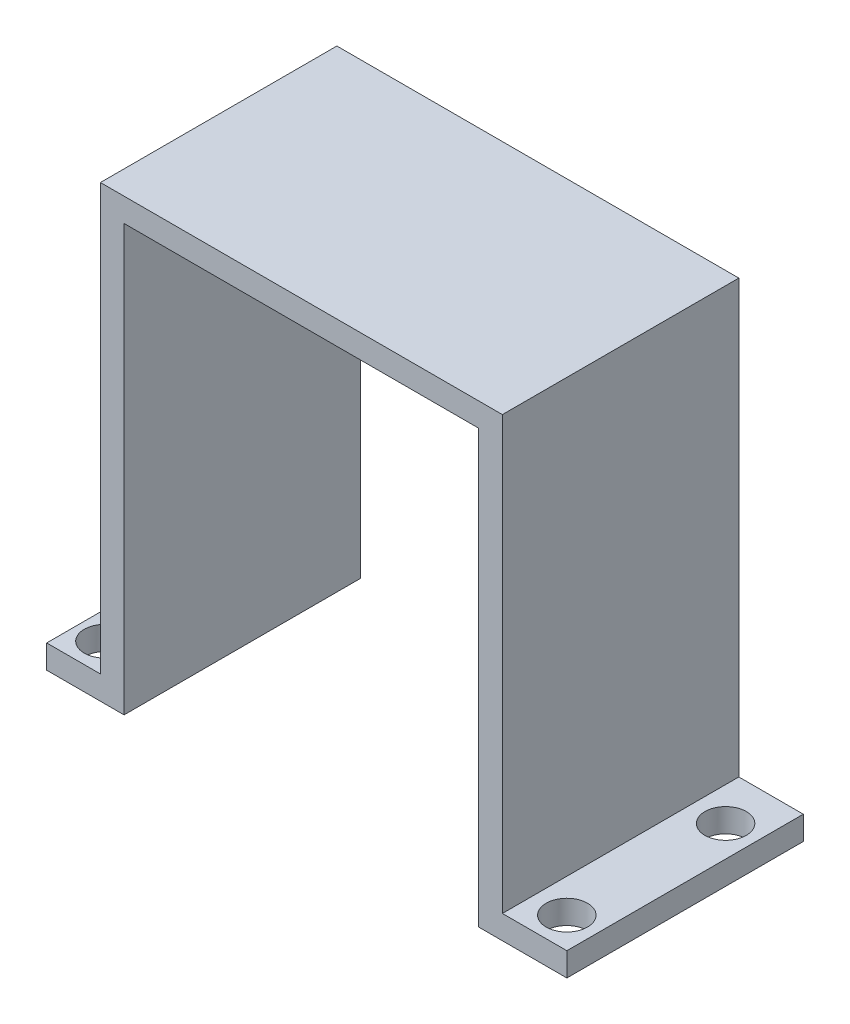
ISO-10303-21;
HEADER;
FILE_DESCRIPTION(('STEP AP214'),'2;1');
FILE_NAME('part.step','',(''),(''),'','','');
FILE_SCHEMA(('AUTOMOTIVE_DESIGN { 1 0 10303 214 1 1 1 1 }'));
ENDSEC;
DATA;
#1=APPLICATION_CONTEXT('core data for automotive mechanical design processes');
#2=APPLICATION_PROTOCOL_DEFINITION('international standard','automotive_design',2000,#1);
#3=PRODUCT_CONTEXT('',#1,'mechanical');
#4=PRODUCT('Part','Part','',(#3));
#5=PRODUCT_RELATED_PRODUCT_CATEGORY('part','',(#4));
#6=PRODUCT_DEFINITION_FORMATION('','',#4);
#7=PRODUCT_DEFINITION_CONTEXT('part definition',#1,'design');
#8=PRODUCT_DEFINITION('design','',#6,#7);
#9=PRODUCT_DEFINITION_SHAPE('','',#8);
#10=(LENGTH_UNIT() NAMED_UNIT(*) SI_UNIT(.MILLI.,.METRE.));
#11=(NAMED_UNIT(*) PLANE_ANGLE_UNIT() SI_UNIT($,.RADIAN.));
#12=(NAMED_UNIT(*) SI_UNIT($,.STERADIAN.) SOLID_ANGLE_UNIT());
#13=UNCERTAINTY_MEASURE_WITH_UNIT(LENGTH_MEASURE(1.E-05),#10,'distance_accuracy_value','');
#14=(GEOMETRIC_REPRESENTATION_CONTEXT(3) GLOBAL_UNCERTAINTY_ASSIGNED_CONTEXT((#13)) GLOBAL_UNIT_ASSIGNED_CONTEXT((#10,
#11,#12)) REPRESENTATION_CONTEXT('',''));
#15=CARTESIAN_POINT('',(0.,0.,0.));
#16=DIRECTION('',(0.,0.,1.));
#17=DIRECTION('',(1.,0.,0.));
#18=AXIS2_PLACEMENT_3D('',#15,#16,#17);
#19=CARTESIAN_POINT('',(7.34336609336604,17.5454545454545,20.));
#20=DIRECTION('',(0.,-1.,0.));
#21=DIRECTION('',(1.,0.,0.));
#22=AXIS2_PLACEMENT_3D('',#19,#20,#21);
#23=PLANE('',#22);
#24=DIRECTION('',(-1.,0.,0.));
#25=VECTOR('',#24,1.);
#26=CARTESIAN_POINT('',(7.34336609336604,17.5454545454545,0.));
#27=LINE('',#26,#25);
#28=CARTESIAN_POINT('',(7.34336609336604,17.5454545454545,0.));
#29=VERTEX_POINT('',#28);
#30=CARTESIAN_POINT('',(-22.656633906634,17.5454545454545,0.));
#31=VERTEX_POINT('',#30);
#32=EDGE_CURVE('E160',#29,#31,#27,.T.);
#33=ORIENTED_EDGE('',*,*,#32,.F.);
#34=DIRECTION('',(0.,0.,-1.));
#35=VECTOR('',#34,1.);
#36=CARTESIAN_POINT('',(7.34336609336604,17.5454545454545,20.));
#37=LINE('',#36,#35);
#38=CARTESIAN_POINT('',(7.34336609336604,17.5454545454545,20.));
#39=VERTEX_POINT('',#38);
#40=EDGE_CURVE('E239',#39,#29,#37,.T.);
#41=ORIENTED_EDGE('',*,*,#40,.F.);
#42=DIRECTION('',(-1.,0.,0.));
#43=VECTOR('',#42,1.);
#44=CARTESIAN_POINT('',(7.34336609336604,17.5454545454545,20.));
#45=LINE('',#44,#43);
#46=CARTESIAN_POINT('',(-22.656633906634,17.5454545454545,20.));
#47=VERTEX_POINT('',#46);
#48=EDGE_CURVE('E168',#39,#47,#45,.T.);
#49=ORIENTED_EDGE('',*,*,#48,.T.);
#50=DIRECTION('',(0.,0.,-1.));
#51=VECTOR('',#50,1.);
#52=CARTESIAN_POINT('',(-22.656633906634,17.5454545454545,20.));
#53=LINE('',#52,#51);
#54=EDGE_CURVE('E204',#47,#31,#53,.T.);
#55=ORIENTED_EDGE('',*,*,#54,.T.);
#56=EDGE_LOOP('',(#33,#41,#49,#55));
#57=FACE_BOUND('',#56,.T.);
#58=ADVANCED_FACE('F33',(#57),#23,.T.);
#59=CARTESIAN_POINT('',(7.34336609336604,-19.,20.));
#60=DIRECTION('',(-1.,0.,0.));
#61=DIRECTION('',(0.,0.,1.));
#62=AXIS2_PLACEMENT_3D('',#59,#60,#61);
#63=PLANE('',#62);
#64=DIRECTION('',(0.,1.,0.));
#65=VECTOR('',#64,1.);
#66=CARTESIAN_POINT('',(7.34336609336604,-19.,0.));
#67=LINE('',#66,#65);
#68=CARTESIAN_POINT('',(7.34336609336604,-19.,0.));
#69=VERTEX_POINT('',#68);
#70=EDGE_CURVE('E172',#69,#29,#67,.T.);
#71=ORIENTED_EDGE('',*,*,#70,.F.);
#72=DIRECTION('',(0.,0.,-1.));
#73=VECTOR('',#72,1.);
#74=CARTESIAN_POINT('',(7.34336609336604,-19.,20.));
#75=LINE('',#74,#73);
#76=CARTESIAN_POINT('',(7.34336609336604,-19.,20.));
#77=VERTEX_POINT('',#76);
#78=EDGE_CURVE('E242',#77,#69,#75,.T.);
#79=ORIENTED_EDGE('',*,*,#78,.F.);
#80=DIRECTION('',(0.,1.,0.));
#81=VECTOR('',#80,1.);
#82=CARTESIAN_POINT('',(7.34336609336604,-19.,20.));
#83=LINE('',#82,#81);
#84=EDGE_CURVE('E201',#77,#39,#83,.T.);
#85=ORIENTED_EDGE('',*,*,#84,.T.);
#86=ORIENTED_EDGE('',*,*,#40,.T.);
#87=EDGE_LOOP('',(#71,#79,#85,#86));
#88=FACE_BOUND('',#87,.T.);
#89=ADVANCED_FACE('F332',(#88),#63,.T.);
#90=CARTESIAN_POINT('',(14.7979115479116,-19.,20.));
#91=DIRECTION('',(0.,-1.,0.));
#92=DIRECTION('',(0.,0.,-1.));
#93=AXIS2_PLACEMENT_3D('',#90,#91,#92);
#94=PLANE('',#93);
#95=CARTESIAN_POINT('',(12.1897996861815,-19.,3.96520095725261));
#96=DIRECTION('',(0.,-1.,0.));
#97=DIRECTION('',(0.,0.,-1.));
#98=AXIS2_PLACEMENT_3D('',#95,#96,#97);
#99=CIRCLE('',#98,1.74999999999999);
#100=CARTESIAN_POINT('',(12.1897996861815,-19.,2.21520095725262));
#101=VERTEX_POINT('',#100);
#102=EDGE_CURVE('E264',#101,#101,#99,.T.);
#103=ORIENTED_EDGE('',*,*,#102,.F.);
#104=EDGE_LOOP('',(#103));
#105=FACE_BOUND('',#104,.T.);
#106=CARTESIAN_POINT('',(12.1897996861815,-19.,17.3968590723765));
#107=DIRECTION('',(0.,-1.,0.));
#108=DIRECTION('',(0.,0.,-1.));
#109=AXIS2_PLACEMENT_3D('',#106,#107,#108);
#110=CIRCLE('',#109,1.74999999999999);
#111=CARTESIAN_POINT('',(12.1897996861815,-19.,15.6468590723765));
#112=VERTEX_POINT('',#111);
#113=EDGE_CURVE('E280',#112,#112,#110,.T.);
#114=ORIENTED_EDGE('',*,*,#113,.F.);
#115=EDGE_LOOP('',(#114));
#116=FACE_BOUND('',#115,.T.);
#117=DIRECTION('',(-1.,0.,0.));
#118=VECTOR('',#117,1.);
#119=CARTESIAN_POINT('',(14.7979115479116,-19.,0.));
#120=LINE('',#119,#118);
#121=CARTESIAN_POINT('',(14.7979115479116,-19.,0.));
#122=VERTEX_POINT('',#121);
#123=EDGE_CURVE('E234',#122,#69,#120,.T.);
#124=ORIENTED_EDGE('',*,*,#123,.F.);
#125=DIRECTION('',(0.,0.,-1.));
#126=VECTOR('',#125,1.);
#127=CARTESIAN_POINT('',(14.7979115479116,-19.,20.));
#128=LINE('',#127,#126);
#129=CARTESIAN_POINT('',(14.7979115479116,-19.,20.));
#130=VERTEX_POINT('',#129);
#131=EDGE_CURVE('E244',#130,#122,#128,.T.);
#132=ORIENTED_EDGE('',*,*,#131,.F.);
#133=DIRECTION('',(-1.,0.,0.));
#134=VECTOR('',#133,1.);
#135=CARTESIAN_POINT('',(14.7979115479116,-19.,20.));
#136=LINE('',#135,#134);
#137=EDGE_CURVE('E198',#130,#77,#136,.T.);
#138=ORIENTED_EDGE('',*,*,#137,.T.);
#139=ORIENTED_EDGE('',*,*,#78,.T.);
#140=EDGE_LOOP('',(#124,#132,#138,#139));
#141=FACE_BOUND('',#140,.T.);
#142=ADVANCED_FACE('F353',(#105,#116,#141),#94,.T.);
#143=CARTESIAN_POINT('',(14.7979115479116,-17.,20.));
#144=DIRECTION('',(1.,0.,0.));
#145=DIRECTION('',(0.,0.,-1.));
#146=AXIS2_PLACEMENT_3D('',#143,#144,#145);
#147=PLANE('',#146);
#148=DIRECTION('',(0.,-1.,0.));
#149=VECTOR('',#148,1.);
#150=CARTESIAN_POINT('',(14.7979115479116,-17.,0.));
#151=LINE('',#150,#149);
#152=CARTESIAN_POINT('',(14.7979115479116,-17.,0.));
#153=VERTEX_POINT('',#152);
#154=EDGE_CURVE('E231',#153,#122,#151,.T.);
#155=ORIENTED_EDGE('',*,*,#154,.F.);
#156=DIRECTION('',(0.,0.,-1.));
#157=VECTOR('',#156,1.);
#158=CARTESIAN_POINT('',(14.7979115479116,-17.,20.));
#159=LINE('',#158,#157);
#160=CARTESIAN_POINT('',(14.7979115479116,-17.,20.));
#161=VERTEX_POINT('',#160);
#162=EDGE_CURVE('E246',#161,#153,#159,.T.);
#163=ORIENTED_EDGE('',*,*,#162,.F.);
#164=DIRECTION('',(0.,-1.,0.));
#165=VECTOR('',#164,1.);
#166=CARTESIAN_POINT('',(14.7979115479116,-17.,20.));
#167=LINE('',#166,#165);
#168=EDGE_CURVE('E195',#161,#130,#167,.T.);
#169=ORIENTED_EDGE('',*,*,#168,.T.);
#170=ORIENTED_EDGE('',*,*,#131,.T.);
#171=EDGE_LOOP('',(#155,#163,#169,#170));
#172=FACE_BOUND('',#171,.T.);
#173=ADVANCED_FACE('F339',(#172),#147,.T.);
#174=CARTESIAN_POINT('',(9.34336609336604,-17.,20.));
#175=DIRECTION('',(0.,1.,0.));
#176=DIRECTION('',(0.,0.,1.));
#177=AXIS2_PLACEMENT_3D('',#174,#175,#176);
#178=PLANE('',#177);
#179=CARTESIAN_POINT('',(12.1897996861815,-17.,3.96520095725261));
#180=DIRECTION('',(0.,1.,0.));
#181=DIRECTION('',(0.,0.,1.));
#182=AXIS2_PLACEMENT_3D('',#179,#180,#181);
#183=CIRCLE('',#182,1.74999999999999);
#184=CARTESIAN_POINT('',(12.1897996861815,-17.,5.7152009572526));
#185=VERTEX_POINT('',#184);
#186=EDGE_CURVE('E268',#185,#185,#183,.T.);
#187=ORIENTED_EDGE('',*,*,#186,.F.);
#188=EDGE_LOOP('',(#187));
#189=FACE_BOUND('',#188,.T.);
#190=CARTESIAN_POINT('',(12.1897996861815,-17.,17.3968590723765));
#191=DIRECTION('',(0.,1.,0.));
#192=DIRECTION('',(0.,0.,1.));
#193=AXIS2_PLACEMENT_3D('',#190,#191,#192);
#194=CIRCLE('',#193,1.74999999999999);
#195=CARTESIAN_POINT('',(12.1897996861815,-17.,19.1468590723765));
#196=VERTEX_POINT('',#195);
#197=EDGE_CURVE('E267',#196,#196,#194,.T.);
#198=ORIENTED_EDGE('',*,*,#197,.F.);
#199=EDGE_LOOP('',(#198));
#200=FACE_BOUND('',#199,.T.);
#201=DIRECTION('',(1.,0.,0.));
#202=VECTOR('',#201,1.);
#203=CARTESIAN_POINT('',(9.34336609336604,-17.,0.));
#204=LINE('',#203,#202);
#205=CARTESIAN_POINT('',(9.34336609336604,-17.,0.));
#206=VERTEX_POINT('',#205);
#207=EDGE_CURVE('E228',#206,#153,#204,.T.);
#208=ORIENTED_EDGE('',*,*,#207,.F.);
#209=DIRECTION('',(0.,0.,-1.));
#210=VECTOR('',#209,1.);
#211=CARTESIAN_POINT('',(9.34336609336604,-17.,20.));
#212=LINE('',#211,#210);
#213=CARTESIAN_POINT('',(9.34336609336604,-17.,20.));
#214=VERTEX_POINT('',#213);
#215=EDGE_CURVE('E248',#214,#206,#212,.T.);
#216=ORIENTED_EDGE('',*,*,#215,.F.);
#217=DIRECTION('',(1.,0.,0.));
#218=VECTOR('',#217,1.);
#219=CARTESIAN_POINT('',(9.34336609336604,-17.,20.));
#220=LINE('',#219,#218);
#221=EDGE_CURVE('E192',#214,#161,#220,.T.);
#222=ORIENTED_EDGE('',*,*,#221,.T.);
#223=ORIENTED_EDGE('',*,*,#162,.T.);
#224=EDGE_LOOP('',(#208,#216,#222,#223));
#225=FACE_BOUND('',#224,.T.);
#226=ADVANCED_FACE('F343',(#189,#200,#225),#178,.T.);
#227=CARTESIAN_POINT('',(9.34336609336604,19.5454545454545,20.));
#228=DIRECTION('',(1.,0.,0.));
#229=DIRECTION('',(0.,1.,0.));
#230=AXIS2_PLACEMENT_3D('',#227,#228,#229);
#231=PLANE('',#230);
#232=DIRECTION('',(0.,-1.,0.));
#233=VECTOR('',#232,1.);
#234=CARTESIAN_POINT('',(9.34336609336604,19.5454545454545,0.));
#235=LINE('',#234,#233);
#236=CARTESIAN_POINT('',(9.34336609336604,19.5454545454545,0.));
#237=VERTEX_POINT('',#236);
#238=EDGE_CURVE('E225',#237,#206,#235,.T.);
#239=ORIENTED_EDGE('',*,*,#238,.F.);
#240=DIRECTION('',(0.,0.,-1.));
#241=VECTOR('',#240,1.);
#242=CARTESIAN_POINT('',(9.34336609336604,19.5454545454545,20.));
#243=LINE('',#242,#241);
#244=CARTESIAN_POINT('',(9.34336609336604,19.5454545454545,20.));
#245=VERTEX_POINT('',#244);
#246=EDGE_CURVE('E250',#245,#237,#243,.T.);
#247=ORIENTED_EDGE('',*,*,#246,.F.);
#248=DIRECTION('',(0.,-1.,0.));
#249=VECTOR('',#248,1.);
#250=CARTESIAN_POINT('',(9.34336609336604,19.5454545454545,20.));
#251=LINE('',#250,#249);
#252=EDGE_CURVE('E189',#245,#214,#251,.T.);
#253=ORIENTED_EDGE('',*,*,#252,.T.);
#254=ORIENTED_EDGE('',*,*,#215,.T.);
#255=EDGE_LOOP('',(#239,#247,#253,#254));
#256=FACE_BOUND('',#255,.T.);
#257=ADVANCED_FACE('F348',(#256),#231,.T.);
#258=CARTESIAN_POINT('',(-24.656633906634,19.5454545454545,20.));
#259=DIRECTION('',(0.,1.,0.));
#260=DIRECTION('',(0.,0.,1.));
#261=AXIS2_PLACEMENT_3D('',#258,#259,#260);
#262=PLANE('',#261);
#263=DIRECTION('',(1.,0.,0.));
#264=VECTOR('',#263,1.);
#265=CARTESIAN_POINT('',(-24.656633906634,19.5454545454545,0.));
#266=LINE('',#265,#264);
#267=CARTESIAN_POINT('',(-24.656633906634,19.5454545454545,0.));
#268=VERTEX_POINT('',#267);
#269=EDGE_CURVE('E222',#268,#237,#266,.T.);
#270=ORIENTED_EDGE('',*,*,#269,.F.);
#271=DIRECTION('',(0.,0.,-1.));
#272=VECTOR('',#271,1.);
#273=CARTESIAN_POINT('',(-24.656633906634,19.5454545454545,20.));
#274=LINE('',#273,#272);
#275=CARTESIAN_POINT('',(-24.656633906634,19.5454545454545,20.));
#276=VERTEX_POINT('',#275);
#277=EDGE_CURVE('E252',#276,#268,#274,.T.);
#278=ORIENTED_EDGE('',*,*,#277,.F.);
#279=DIRECTION('',(1.,0.,0.));
#280=VECTOR('',#279,1.);
#281=CARTESIAN_POINT('',(-24.656633906634,19.5454545454545,20.));
#282=LINE('',#281,#280);
#283=EDGE_CURVE('E186',#276,#245,#282,.T.);
#284=ORIENTED_EDGE('',*,*,#283,.T.);
#285=ORIENTED_EDGE('',*,*,#246,.T.);
#286=EDGE_LOOP('',(#270,#278,#284,#285));
#287=FACE_BOUND('',#286,.T.);
#288=ADVANCED_FACE('F351',(#287),#262,.T.);
#289=CARTESIAN_POINT('',(-24.656633906634,-16.4545454545455,20.));
#290=DIRECTION('',(-1.,0.,0.));
#291=DIRECTION('',(0.,0.,1.));
#292=AXIS2_PLACEMENT_3D('',#289,#290,#291);
#293=PLANE('',#292);
#294=DIRECTION('',(0.,1.,0.));
#295=VECTOR('',#294,1.);
#296=CARTESIAN_POINT('',(-24.656633906634,-16.4545454545455,0.));
#297=LINE('',#296,#295);
#298=CARTESIAN_POINT('',(-24.656633906634,-16.4545454545455,0.));
#299=VERTEX_POINT('',#298);
#300=EDGE_CURVE('E219',#299,#268,#297,.T.);
#301=ORIENTED_EDGE('',*,*,#300,.F.);
#302=DIRECTION('',(0.,0.,-1.));
#303=VECTOR('',#302,1.);
#304=CARTESIAN_POINT('',(-24.656633906634,-16.4545454545455,20.));
#305=LINE('',#304,#303);
#306=CARTESIAN_POINT('',(-24.656633906634,-16.4545454545455,20.));
#307=VERTEX_POINT('',#306);
#308=EDGE_CURVE('E254',#307,#299,#305,.T.);
#309=ORIENTED_EDGE('',*,*,#308,.F.);
#310=DIRECTION('',(0.,1.,0.));
#311=VECTOR('',#310,1.);
#312=CARTESIAN_POINT('',(-24.656633906634,-16.4545454545455,20.));
#313=LINE('',#312,#311);
#314=EDGE_CURVE('E183',#307,#276,#313,.T.);
#315=ORIENTED_EDGE('',*,*,#314,.T.);
#316=ORIENTED_EDGE('',*,*,#277,.T.);
#317=EDGE_LOOP('',(#301,#309,#315,#316));
#318=FACE_BOUND('',#317,.T.);
#319=ADVANCED_FACE('F303',(#318),#293,.T.);
#320=CARTESIAN_POINT('',(-29.2020884520885,-16.4545454545455,20.));
#321=DIRECTION('',(0.,1.,0.));
#322=DIRECTION('',(0.,0.,1.));
#323=AXIS2_PLACEMENT_3D('',#320,#321,#322);
#324=PLANE('',#323);
#325=CARTESIAN_POINT('',(-26.8643753375741,-16.4545454545455,17.4113133420661));
#326=DIRECTION('',(0.,1.,0.));
#327=DIRECTION('',(0.,0.,1.));
#328=AXIS2_PLACEMENT_3D('',#325,#326,#327);
#329=CIRCLE('',#328,1.74999999999999);
#330=CARTESIAN_POINT('',(-26.8643753375741,-16.4545454545455,19.1613133420661));
#331=VERTEX_POINT('',#330);
#332=EDGE_CURVE('E294',#331,#331,#329,.T.);
#333=ORIENTED_EDGE('',*,*,#332,.F.);
#334=EDGE_LOOP('',(#333));
#335=FACE_BOUND('',#334,.T.);
#336=CARTESIAN_POINT('',(-26.8643753375741,-16.4545454545455,4.22877011904532));
#337=DIRECTION('',(0.,1.,0.));
#338=DIRECTION('',(0.,0.,1.));
#339=AXIS2_PLACEMENT_3D('',#336,#337,#338);
#340=CIRCLE('',#339,1.74999999999999);
#341=CARTESIAN_POINT('',(-26.8643753375741,-16.4545454545455,5.97877011904531));
#342=VERTEX_POINT('',#341);
#343=EDGE_CURVE('E154',#342,#342,#340,.T.);
#344=ORIENTED_EDGE('',*,*,#343,.F.);
#345=EDGE_LOOP('',(#344));
#346=FACE_BOUND('',#345,.T.);
#347=DIRECTION('',(1.,0.,0.));
#348=VECTOR('',#347,1.);
#349=CARTESIAN_POINT('',(-29.2020884520885,-16.4545454545455,0.));
#350=LINE('',#349,#348);
#351=CARTESIAN_POINT('',(-29.2020884520885,-16.4545454545455,0.));
#352=VERTEX_POINT('',#351);
#353=EDGE_CURVE('E216',#352,#299,#350,.T.);
#354=ORIENTED_EDGE('',*,*,#353,.F.);
#355=DIRECTION('',(0.,0.,-1.));
#356=VECTOR('',#355,1.);
#357=CARTESIAN_POINT('',(-29.2020884520885,-16.4545454545455,20.));
#358=LINE('',#357,#356);
#359=CARTESIAN_POINT('',(-29.2020884520885,-16.4545454545455,20.));
#360=VERTEX_POINT('',#359);
#361=EDGE_CURVE('E256',#360,#352,#358,.T.);
#362=ORIENTED_EDGE('',*,*,#361,.F.);
#363=DIRECTION('',(1.,0.,0.));
#364=VECTOR('',#363,1.);
#365=CARTESIAN_POINT('',(-29.2020884520885,-16.4545454545455,20.));
#366=LINE('',#365,#364);
#367=EDGE_CURVE('E180',#360,#307,#366,.T.);
#368=ORIENTED_EDGE('',*,*,#367,.T.);
#369=ORIENTED_EDGE('',*,*,#308,.T.);
#370=EDGE_LOOP('',(#354,#362,#368,#369));
#371=FACE_BOUND('',#370,.T.);
#372=ADVANCED_FACE('F299',(#335,#346,#371),#324,.T.);
#373=CARTESIAN_POINT('',(-29.2020884520885,-18.4545454545455,20.));
#374=DIRECTION('',(-1.,0.,0.));
#375=DIRECTION('',(0.,0.,1.));
#376=AXIS2_PLACEMENT_3D('',#373,#374,#375);
#377=PLANE('',#376);
#378=DIRECTION('',(0.,1.,0.));
#379=VECTOR('',#378,1.);
#380=CARTESIAN_POINT('',(-29.2020884520885,-18.4545454545455,0.));
#381=LINE('',#380,#379);
#382=CARTESIAN_POINT('',(-29.2020884520885,-18.4545454545455,0.));
#383=VERTEX_POINT('',#382);
#384=EDGE_CURVE('E213',#383,#352,#381,.T.);
#385=ORIENTED_EDGE('',*,*,#384,.F.);
#386=DIRECTION('',(0.,0.,-1.));
#387=VECTOR('',#386,1.);
#388=CARTESIAN_POINT('',(-29.2020884520885,-18.4545454545455,20.));
#389=LINE('',#388,#387);
#390=CARTESIAN_POINT('',(-29.2020884520885,-18.4545454545455,20.));
#391=VERTEX_POINT('',#390);
#392=EDGE_CURVE('E258',#391,#383,#389,.T.);
#393=ORIENTED_EDGE('',*,*,#392,.F.);
#394=DIRECTION('',(0.,1.,0.));
#395=VECTOR('',#394,1.);
#396=CARTESIAN_POINT('',(-29.2020884520885,-18.4545454545455,20.));
#397=LINE('',#396,#395);
#398=EDGE_CURVE('E177',#391,#360,#397,.T.);
#399=ORIENTED_EDGE('',*,*,#398,.T.);
#400=ORIENTED_EDGE('',*,*,#361,.T.);
#401=EDGE_LOOP('',(#385,#393,#399,#400));
#402=FACE_BOUND('',#401,.T.);
#403=ADVANCED_FACE('F302',(#402),#377,.T.);
#404=CARTESIAN_POINT('',(-22.656633906634,-18.4545454545455,20.));
#405=DIRECTION('',(0.,-1.,0.));
#406=DIRECTION('',(0.,0.,-1.));
#407=AXIS2_PLACEMENT_3D('',#404,#405,#406);
#408=PLANE('',#407);
#409=CARTESIAN_POINT('',(-26.8643753375741,-18.4545454545455,17.4113133420661));
#410=DIRECTION('',(0.,-1.,0.));
#411=DIRECTION('',(0.,0.,-1.));
#412=AXIS2_PLACEMENT_3D('',#409,#410,#411);
#413=CIRCLE('',#412,1.74999999999999);
#414=CARTESIAN_POINT('',(-26.6398201571993,-18.4545454545455,19.1468463930239));
#415=VERTEX_POINT('',#414);
#416=CARTESIAN_POINT('',(-26.8577136881252,-18.4545454545455,15.6613260214188));
#417=VERTEX_POINT('',#416);
#418=EDGE_CURVE('E47',#415,#417,#413,.T.);
#419=ORIENTED_EDGE('',*,*,#418,.F.);
#420=CARTESIAN_POINT('',(-26.6331585077504,-18.4545454545455,17.3968590723765));
#421=DIRECTION('',(0.,-1.,0.));
#422=DIRECTION('',(0.,0.,-1.));
#423=AXIS2_PLACEMENT_3D('',#420,#421,#422);
#424=CIRCLE('',#423,1.74999999999999);
#425=EDGE_CURVE('E157',#417,#415,#424,.T.);
#426=ORIENTED_EDGE('',*,*,#425,.F.);
#427=EDGE_LOOP('',(#419,#426));
#428=FACE_BOUND('',#427,.T.);
#429=CARTESIAN_POINT('',(-26.8643753375741,-18.4545454545455,4.22877011904532));
#430=DIRECTION('',(0.,-1.,0.));
#431=DIRECTION('',(0.,0.,-1.));
#432=AXIS2_PLACEMENT_3D('',#429,#430,#431);
#433=CIRCLE('',#432,1.74999999999999);
#434=CARTESIAN_POINT('',(-25.4398450223423,-18.4545454545455,5.24524116191149));
#435=VERTEX_POINT('',#434);
#436=CARTESIAN_POINT('',(-28.0576888229822,-18.4545454545455,2.94872991438644));
#437=VERTEX_POINT('',#436);
#438=EDGE_CURVE('E55',#435,#437,#433,.T.);
#439=ORIENTED_EDGE('',*,*,#438,.F.);
#440=CARTESIAN_POINT('',(-26.6331585077504,-18.4545454545455,3.96520095725261));
#441=DIRECTION('',(0.,-1.,0.));
#442=DIRECTION('',(0.,0.,-1.));
#443=AXIS2_PLACEMENT_3D('',#440,#441,#442);
#444=CIRCLE('',#443,1.74999999999999);
#445=EDGE_CURVE('E158',#437,#435,#444,.T.);
#446=ORIENTED_EDGE('',*,*,#445,.F.);
#447=EDGE_LOOP('',(#439,#446));
#448=FACE_BOUND('',#447,.T.);
#449=DIRECTION('',(-1.,0.,0.));
#450=VECTOR('',#449,1.);
#451=CARTESIAN_POINT('',(-22.656633906634,-18.4545454545455,0.));
#452=LINE('',#451,#450);
#453=CARTESIAN_POINT('',(-22.656633906634,-18.4545454545455,0.));
#454=VERTEX_POINT('',#453);
#455=EDGE_CURVE('E210',#454,#383,#452,.T.);
#456=ORIENTED_EDGE('',*,*,#455,.F.);
#457=DIRECTION('',(0.,0.,-1.));
#458=VECTOR('',#457,1.);
#459=CARTESIAN_POINT('',(-22.656633906634,-18.4545454545455,20.));
#460=LINE('',#459,#458);
#461=CARTESIAN_POINT('',(-22.656633906634,-18.4545454545455,20.));
#462=VERTEX_POINT('',#461);
#463=EDGE_CURVE('E260',#462,#454,#460,.T.);
#464=ORIENTED_EDGE('',*,*,#463,.F.);
#465=DIRECTION('',(-1.,0.,0.));
#466=VECTOR('',#465,1.);
#467=CARTESIAN_POINT('',(-22.656633906634,-18.4545454545455,20.));
#468=LINE('',#467,#466);
#469=EDGE_CURVE('E174',#462,#391,#468,.T.);
#470=ORIENTED_EDGE('',*,*,#469,.T.);
#471=ORIENTED_EDGE('',*,*,#392,.T.);
#472=EDGE_LOOP('',(#456,#464,#470,#471));
#473=FACE_BOUND('',#472,.T.);
#474=ADVANCED_FACE('F324',(#428,#448,#473),#408,.T.);
#475=CARTESIAN_POINT('',(-22.656633906634,-16.4545454545455,20.));
#476=DIRECTION('',(1.,0.,0.));
#477=DIRECTION('',(0.,0.,-1.));
#478=AXIS2_PLACEMENT_3D('',#475,#476,#477);
#479=PLANE('',#478);
#480=DIRECTION('',(0.,-1.,0.));
#481=VECTOR('',#480,1.);
#482=CARTESIAN_POINT('',(-22.656633906634,-16.4545454545455,0.));
#483=LINE('',#482,#481);
#484=EDGE_CURVE('E207',#31,#454,#483,.T.);
#485=ORIENTED_EDGE('',*,*,#484,.F.);
#486=ORIENTED_EDGE('',*,*,#54,.F.);
#487=DIRECTION('',(0.,-1.,0.));
#488=VECTOR('',#487,1.);
#489=CARTESIAN_POINT('',(-22.656633906634,17.5454545454545,20.));
#490=LINE('',#489,#488);
#491=EDGE_CURVE('E171',#47,#462,#490,.T.);
#492=ORIENTED_EDGE('',*,*,#491,.T.);
#493=ORIENTED_EDGE('',*,*,#463,.T.);
#494=EDGE_LOOP('',(#485,#486,#492,#493));
#495=FACE_BOUND('',#494,.T.);
#496=ADVANCED_FACE('F326',(#495),#479,.T.);
#497=CARTESIAN_POINT('',(0.,0.,20.));
#498=DIRECTION('',(0.,0.,1.));
#499=DIRECTION('',(1.,0.,0.));
#500=AXIS2_PLACEMENT_3D('',#497,#498,#499);
#501=PLANE('',#500);
#502=ORIENTED_EDGE('',*,*,#48,.F.);
#503=ORIENTED_EDGE('',*,*,#84,.F.);
#504=ORIENTED_EDGE('',*,*,#137,.F.);
#505=ORIENTED_EDGE('',*,*,#168,.F.);
#506=ORIENTED_EDGE('',*,*,#221,.F.);
#507=ORIENTED_EDGE('',*,*,#252,.F.);
#508=ORIENTED_EDGE('',*,*,#283,.F.);
#509=ORIENTED_EDGE('',*,*,#314,.F.);
#510=ORIENTED_EDGE('',*,*,#367,.F.);
#511=ORIENTED_EDGE('',*,*,#398,.F.);
#512=ORIENTED_EDGE('',*,*,#469,.F.);
#513=ORIENTED_EDGE('',*,*,#491,.F.);
#514=EDGE_LOOP('',(#502,#503,#504,#505,#506,#507,#508,#509,#510,#511,#512,#513));
#515=FACE_BOUND('',#514,.T.);
#516=ADVANCED_FACE('F319',(#515),#501,.T.);
#517=CARTESIAN_POINT('',(0.,0.,0.));
#518=DIRECTION('',(0.,0.,1.));
#519=DIRECTION('',(1.,0.,0.));
#520=AXIS2_PLACEMENT_3D('',#517,#518,#519);
#521=PLANE('',#520);
#522=ORIENTED_EDGE('',*,*,#32,.T.);
#523=ORIENTED_EDGE('',*,*,#484,.T.);
#524=ORIENTED_EDGE('',*,*,#455,.T.);
#525=ORIENTED_EDGE('',*,*,#384,.T.);
#526=ORIENTED_EDGE('',*,*,#353,.T.);
#527=ORIENTED_EDGE('',*,*,#300,.T.);
#528=ORIENTED_EDGE('',*,*,#269,.T.);
#529=ORIENTED_EDGE('',*,*,#238,.T.);
#530=ORIENTED_EDGE('',*,*,#207,.T.);
#531=ORIENTED_EDGE('',*,*,#154,.T.);
#532=ORIENTED_EDGE('',*,*,#123,.T.);
#533=ORIENTED_EDGE('',*,*,#70,.T.);
#534=EDGE_LOOP('',(#522,#523,#524,#525,#526,#527,#528,#529,#530,#531,#532,#533));
#535=FACE_BOUND('',#534,.T.);
#536=ADVANCED_FACE('F312',(#535),#521,.F.);
#537=CARTESIAN_POINT('',(-24.8831585077504,-17.,17.3968590723765));
#538=DIRECTION('',(0.,1.,0.));
#539=DIRECTION('',(0.,0.,1.));
#540=AXIS2_PLACEMENT_3D('',#537,#538,#539);
#541=PLANE('',#540);
#542=CARTESIAN_POINT('',(-26.6331585077504,-17.,17.3968590723765));
#543=DIRECTION('',(0.,1.,0.));
#544=DIRECTION('',(0.,0.,1.));
#545=AXIS2_PLACEMENT_3D('',#542,#543,#544);
#546=CIRCLE('',#545,1.74999999999999);
#547=CARTESIAN_POINT('',(-26.6398201571993,-17.,19.1468463930239));
#548=VERTEX_POINT('',#547);
#549=CARTESIAN_POINT('',(-26.8577136881252,-17.,15.6613260214188));
#550=VERTEX_POINT('',#549);
#551=EDGE_CURVE('E153',#548,#550,#546,.T.);
#552=ORIENTED_EDGE('',*,*,#551,.F.);
#553=CARTESIAN_POINT('',(-26.8643753375741,-17.,17.4113133420661));
#554=DIRECTION('',(0.,1.,0.));
#555=DIRECTION('',(0.,0.,1.));
#556=AXIS2_PLACEMENT_3D('',#553,#554,#555);
#557=CIRCLE('',#556,1.74999999999999);
#558=EDGE_CURVE('E144',#548,#550,#557,.T.);
#559=ORIENTED_EDGE('',*,*,#558,.T.);
#560=EDGE_LOOP('',(#552,#559));
#561=FACE_BOUND('',#560,.T.);
#562=ADVANCED_FACE('F152',(#561),#541,.F.);
#563=CARTESIAN_POINT('',(-26.6331585077504,-17.,17.3968590723765));
#564=DIRECTION('',(0.,1.,0.));
#565=DIRECTION('',(0.,0.,1.));
#566=AXIS2_PLACEMENT_3D('',#563,#564,#565);
#567=CYLINDRICAL_SURFACE('',#566,1.74999999999999);
#568=ORIENTED_EDGE('',*,*,#425,.T.);
#569=DIRECTION('',(0.,1.,0.));
#570=VECTOR('',#569,1.);
#571=CARTESIAN_POINT('',(-26.6398201571993,-21.4545454545455,19.1468463930239));
#572=LINE('',#571,#570);
#573=EDGE_CURVE('E11',#415,#548,#572,.T.);
#574=ORIENTED_EDGE('',*,*,#573,.T.);
#575=ORIENTED_EDGE('',*,*,#551,.T.);
#576=DIRECTION('',(0.,1.,0.));
#577=VECTOR('',#576,1.);
#578=CARTESIAN_POINT('',(-26.8577136881252,-21.4545454545455,15.6613260214188));
#579=LINE('',#578,#577);
#580=EDGE_CURVE('E40',#550,#417,#579,.F.);
#581=ORIENTED_EDGE('',*,*,#580,.T.);
#582=EDGE_LOOP('',(#568,#574,#575,#581));
#583=FACE_BOUND('',#582,.T.);
#584=ADVANCED_FACE('F156',(#583),#567,.F.);
#585=CARTESIAN_POINT('',(-24.8831585077504,-17.,3.96520095725261));
#586=DIRECTION('',(0.,1.,0.));
#587=DIRECTION('',(0.,0.,1.));
#588=AXIS2_PLACEMENT_3D('',#585,#586,#587);
#589=PLANE('',#588);
#590=CARTESIAN_POINT('',(-26.6331585077504,-17.,3.96520095725261));
#591=DIRECTION('',(0.,1.,0.));
#592=DIRECTION('',(0.,0.,1.));
#593=AXIS2_PLACEMENT_3D('',#590,#591,#592);
#594=CIRCLE('',#593,1.74999999999999);
#595=CARTESIAN_POINT('',(-25.4398450223423,-17.,5.24524116191149));
#596=VERTEX_POINT('',#595);
#597=CARTESIAN_POINT('',(-28.0576888229822,-17.,2.94872991438644));
#598=VERTEX_POINT('',#597);
#599=EDGE_CURVE('E163',#596,#598,#594,.T.);
#600=ORIENTED_EDGE('',*,*,#599,.F.);
#601=CARTESIAN_POINT('',(-26.8643753375741,-17.,4.22877011904532));
#602=DIRECTION('',(0.,1.,0.));
#603=DIRECTION('',(0.,0.,1.));
#604=AXIS2_PLACEMENT_3D('',#601,#602,#603);
#605=CIRCLE('',#604,1.74999999999999);
#606=EDGE_CURVE('E279',#596,#598,#605,.T.);
#607=ORIENTED_EDGE('',*,*,#606,.T.);
#608=EDGE_LOOP('',(#600,#607));
#609=FACE_BOUND('',#608,.T.);
#610=ADVANCED_FACE('F278',(#609),#589,.F.);
#611=CARTESIAN_POINT('',(-26.6331585077504,-17.,3.96520095725261));
#612=DIRECTION('',(0.,1.,0.));
#613=DIRECTION('',(0.,0.,1.));
#614=AXIS2_PLACEMENT_3D('',#611,#612,#613);
#615=CYLINDRICAL_SURFACE('',#614,1.74999999999999);
#616=ORIENTED_EDGE('',*,*,#445,.T.);
#617=DIRECTION('',(0.,1.,0.));
#618=VECTOR('',#617,1.);
#619=CARTESIAN_POINT('',(-25.4398450223423,-21.4545454545455,5.24524116191149));
#620=LINE('',#619,#618);
#621=EDGE_CURVE('E149',#435,#596,#620,.T.);
#622=ORIENTED_EDGE('',*,*,#621,.T.);
#623=ORIENTED_EDGE('',*,*,#599,.T.);
#624=DIRECTION('',(0.,1.,0.));
#625=VECTOR('',#624,1.);
#626=CARTESIAN_POINT('',(-28.0576888229822,-21.4545454545455,2.94872991438644));
#627=LINE('',#626,#625);
#628=EDGE_CURVE('E241',#598,#437,#627,.F.);
#629=ORIENTED_EDGE('',*,*,#628,.T.);
#630=EDGE_LOOP('',(#616,#622,#623,#629));
#631=FACE_BOUND('',#630,.T.);
#632=ADVANCED_FACE('F274',(#631),#615,.F.);
#633=CARTESIAN_POINT('',(12.1897996861815,-17.,17.3968590723765));
#634=DIRECTION('',(0.,1.,0.));
#635=DIRECTION('',(0.,0.,1.));
#636=AXIS2_PLACEMENT_3D('',#633,#634,#635);
#637=CYLINDRICAL_SURFACE('',#636,1.74999999999999);
#638=ORIENTED_EDGE('',*,*,#113,.T.);
#639=EDGE_LOOP('',(#638));
#640=FACE_BOUND('',#639,.T.);
#641=ORIENTED_EDGE('',*,*,#197,.T.);
#642=EDGE_LOOP('',(#641));
#643=FACE_BOUND('',#642,.T.);
#644=ADVANCED_FACE('F472',(#640,#643),#637,.F.);
#645=CARTESIAN_POINT('',(12.1897996861815,-17.,3.96520095725261));
#646=DIRECTION('',(0.,1.,0.));
#647=DIRECTION('',(0.,0.,1.));
#648=AXIS2_PLACEMENT_3D('',#645,#646,#647);
#649=CYLINDRICAL_SURFACE('',#648,1.74999999999999);
#650=ORIENTED_EDGE('',*,*,#102,.T.);
#651=EDGE_LOOP('',(#650));
#652=FACE_BOUND('',#651,.T.);
#653=ORIENTED_EDGE('',*,*,#186,.T.);
#654=EDGE_LOOP('',(#653));
#655=FACE_BOUND('',#654,.T.);
#656=ADVANCED_FACE('F479',(#652,#655),#649,.F.);
#657=CARTESIAN_POINT('',(-26.8643753375741,-16.4545454545455,4.22877011904532));
#658=DIRECTION('',(0.,1.,0.));
#659=DIRECTION('',(0.,0.,1.));
#660=AXIS2_PLACEMENT_3D('',#657,#658,#659);
#661=CYLINDRICAL_SURFACE('',#660,1.74999999999999);
#662=ORIENTED_EDGE('',*,*,#343,.T.);
#663=EDGE_LOOP('',(#662));
#664=FACE_BOUND('',#663,.T.);
#665=ORIENTED_EDGE('',*,*,#438,.T.);
#666=ORIENTED_EDGE('',*,*,#628,.F.);
#667=ORIENTED_EDGE('',*,*,#606,.F.);
#668=ORIENTED_EDGE('',*,*,#621,.F.);
#669=EDGE_LOOP('',(#665,#666,#667,#668));
#670=FACE_BOUND('',#669,.T.);
#671=ADVANCED_FACE('F485',(#664,#670),#661,.F.);
#672=CARTESIAN_POINT('',(-26.8643753375741,-16.4545454545455,17.4113133420661));
#673=DIRECTION('',(0.,1.,0.));
#674=DIRECTION('',(0.,0.,1.));
#675=AXIS2_PLACEMENT_3D('',#672,#673,#674);
#676=CYLINDRICAL_SURFACE('',#675,1.74999999999999);
#677=ORIENTED_EDGE('',*,*,#332,.T.);
#678=EDGE_LOOP('',(#677));
#679=FACE_BOUND('',#678,.T.);
#680=ORIENTED_EDGE('',*,*,#418,.T.);
#681=ORIENTED_EDGE('',*,*,#580,.F.);
#682=ORIENTED_EDGE('',*,*,#558,.F.);
#683=ORIENTED_EDGE('',*,*,#573,.F.);
#684=EDGE_LOOP('',(#680,#681,#682,#683));
#685=FACE_BOUND('',#684,.T.);
#686=ADVANCED_FACE('F143',(#679,#685),#676,.F.);
#687=CLOSED_SHELL('',(#58,#89,#142,#173,#226,#257,#288,#319,#372,#403,#474,#496,#516,#536,#562,
#584,#610,#632,#644,#656,#671,#686));
#688=MANIFOLD_SOLID_BREP('B2',#687);
#689=ADVANCED_BREP_SHAPE_REPRESENTATION('',(#18,#688),#14);
#690=SHAPE_DEFINITION_REPRESENTATION(#9,#689);
ENDSEC;
END-ISO-10303-21;
